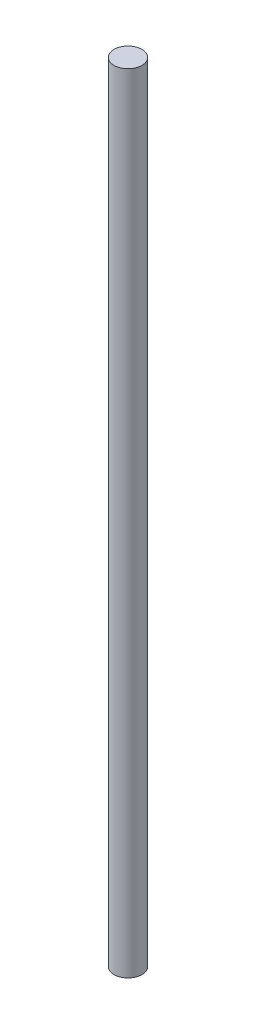
ISO-10303-21;
HEADER;
FILE_DESCRIPTION(('STEP AP214'),'2;1');
FILE_NAME('part.step','',(''),(''),'','','');
FILE_SCHEMA(('AUTOMOTIVE_DESIGN { 1 0 10303 214 1 1 1 1 }'));
ENDSEC;
DATA;
#1=APPLICATION_CONTEXT('core data for automotive mechanical design processes');
#2=APPLICATION_PROTOCOL_DEFINITION('international standard','automotive_design',2000,#1);
#3=PRODUCT_CONTEXT('',#1,'mechanical');
#4=PRODUCT('Part','Part','',(#3));
#5=PRODUCT_RELATED_PRODUCT_CATEGORY('part','',(#4));
#6=PRODUCT_DEFINITION_FORMATION('','',#4);
#7=PRODUCT_DEFINITION_CONTEXT('part definition',#1,'design');
#8=PRODUCT_DEFINITION('design','',#6,#7);
#9=PRODUCT_DEFINITION_SHAPE('','',#8);
#10=(LENGTH_UNIT() NAMED_UNIT(*) SI_UNIT(.MILLI.,.METRE.));
#11=(NAMED_UNIT(*) PLANE_ANGLE_UNIT() SI_UNIT($,.RADIAN.));
#12=(NAMED_UNIT(*) SI_UNIT($,.STERADIAN.) SOLID_ANGLE_UNIT());
#13=UNCERTAINTY_MEASURE_WITH_UNIT(LENGTH_MEASURE(1.E-05),#10,'distance_accuracy_value','');
#14=(GEOMETRIC_REPRESENTATION_CONTEXT(3) GLOBAL_UNCERTAINTY_ASSIGNED_CONTEXT((#13)) GLOBAL_UNIT_ASSIGNED_CONTEXT((#10,
#11,#12)) REPRESENTATION_CONTEXT('',''));
#15=CARTESIAN_POINT('',(0.,0.,0.));
#16=DIRECTION('',(0.,0.,1.));
#17=DIRECTION('',(1.,0.,0.));
#18=AXIS2_PLACEMENT_3D('',#15,#16,#17);
#19=CARTESIAN_POINT('',(0.,706.744000022,0.));
#20=DIRECTION('',(0.,-1.,0.));
#21=DIRECTION('',(0.,0.,-1.));
#22=AXIS2_PLACEMENT_3D('',#19,#20,#21);
#23=CYLINDRICAL_SURFACE('',#22,12.5);
#24=CARTESIAN_POINT('',(0.,706.744000022,0.));
#25=DIRECTION('',(0.,1.,0.));
#26=DIRECTION('',(0.,0.,1.));
#27=AXIS2_PLACEMENT_3D('',#24,#25,#26);
#28=CIRCLE('',#27,12.5);
#29=CARTESIAN_POINT('',(0.,706.744000022,12.5));
#30=VERTEX_POINT('',#29);
#31=EDGE_CURVE('E10',#30,#30,#28,.T.);
#32=ORIENTED_EDGE('',*,*,#31,.F.);
#33=EDGE_LOOP('',(#32));
#34=FACE_BOUND('',#33,.T.);
#35=CARTESIAN_POINT('',(0.,0.,0.));
#36=DIRECTION('',(0.,1.,0.));
#37=DIRECTION('',(0.,0.,1.));
#38=AXIS2_PLACEMENT_3D('',#35,#36,#37);
#39=CIRCLE('',#38,12.5);
#40=CARTESIAN_POINT('',(0.,0.,12.5));
#41=VERTEX_POINT('',#40);
#42=EDGE_CURVE('E44',#41,#41,#39,.T.);
#43=ORIENTED_EDGE('',*,*,#42,.T.);
#44=EDGE_LOOP('',(#43));
#45=FACE_BOUND('',#44,.T.);
#46=ADVANCED_FACE('F41',(#34,#45),#23,.T.);
#47=CARTESIAN_POINT('',(0.,706.744000022,0.));
#48=DIRECTION('',(0.,1.,0.));
#49=DIRECTION('',(0.,0.,1.));
#50=AXIS2_PLACEMENT_3D('',#47,#48,#49);
#51=PLANE('',#50);
#52=ORIENTED_EDGE('',*,*,#31,.T.);
#53=EDGE_LOOP('',(#52));
#54=FACE_BOUND('',#53,.T.);
#55=ADVANCED_FACE('F56',(#54),#51,.T.);
#56=CARTESIAN_POINT('',(0.,0.,0.));
#57=DIRECTION('',(0.,1.,0.));
#58=DIRECTION('',(0.,0.,1.));
#59=AXIS2_PLACEMENT_3D('',#56,#57,#58);
#60=PLANE('',#59);
#61=ORIENTED_EDGE('',*,*,#42,.F.);
#62=EDGE_LOOP('',(#61));
#63=FACE_BOUND('',#62,.T.);
#64=ADVANCED_FACE('F54',(#63),#60,.F.);
#65=CLOSED_SHELL('',(#46,#55,#64));
#66=MANIFOLD_SOLID_BREP('B2',#65);
#67=ADVANCED_BREP_SHAPE_REPRESENTATION('',(#18,#66),#14);
#68=SHAPE_DEFINITION_REPRESENTATION(#9,#67);
ENDSEC;
END-ISO-10303-21;
